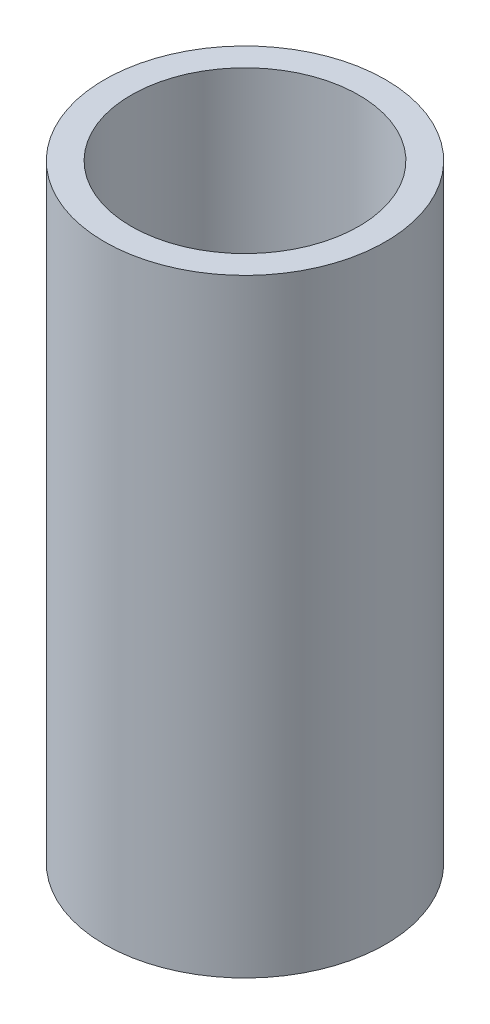
ISO-10303-21;
HEADER;
FILE_DESCRIPTION(('STEP AP214'),'2;1');
FILE_NAME('part.step','',(''),(''),'','','');
FILE_SCHEMA(('AUTOMOTIVE_DESIGN { 1 0 10303 214 1 1 1 1 }'));
ENDSEC;
DATA;
#1=APPLICATION_CONTEXT('core data for automotive mechanical design processes');
#2=APPLICATION_PROTOCOL_DEFINITION('international standard','automotive_design',2000,#1);
#3=PRODUCT_CONTEXT('',#1,'mechanical');
#4=PRODUCT('Part','Part','',(#3));
#5=PRODUCT_RELATED_PRODUCT_CATEGORY('part','',(#4));
#6=PRODUCT_DEFINITION_FORMATION('','',#4);
#7=PRODUCT_DEFINITION_CONTEXT('part definition',#1,'design');
#8=PRODUCT_DEFINITION('design','',#6,#7);
#9=PRODUCT_DEFINITION_SHAPE('','',#8);
#10=(LENGTH_UNIT() NAMED_UNIT(*) SI_UNIT(.MILLI.,.METRE.));
#11=(NAMED_UNIT(*) PLANE_ANGLE_UNIT() SI_UNIT($,.RADIAN.));
#12=(NAMED_UNIT(*) SI_UNIT($,.STERADIAN.) SOLID_ANGLE_UNIT());
#13=UNCERTAINTY_MEASURE_WITH_UNIT(LENGTH_MEASURE(1.E-05),#10,'distance_accuracy_value','');
#14=(GEOMETRIC_REPRESENTATION_CONTEXT(3) GLOBAL_UNCERTAINTY_ASSIGNED_CONTEXT((#13)) GLOBAL_UNIT_ASSIGNED_CONTEXT((#10,
#11,#12)) REPRESENTATION_CONTEXT('',''));
#15=CARTESIAN_POINT('',(0.,0.,0.));
#16=DIRECTION('',(0.,0.,1.));
#17=DIRECTION('',(1.,0.,0.));
#18=AXIS2_PLACEMENT_3D('',#15,#16,#17);
#19=CARTESIAN_POINT('',(0.,55.,0.));
#20=DIRECTION('',(0.,1.,0.));
#21=DIRECTION('',(0.,0.,1.));
#22=AXIS2_PLACEMENT_3D('',#19,#20,#21);
#23=PLANE('',#22);
#24=CARTESIAN_POINT('',(0.,55.,0.));
#25=DIRECTION('',(0.,1.,0.));
#26=DIRECTION('',(0.,0.,1.));
#27=AXIS2_PLACEMENT_3D('',#24,#25,#26);
#28=CIRCLE('',#27,12.7);
#29=CARTESIAN_POINT('',(0.,55.,12.7));
#30=VERTEX_POINT('',#29);
#31=EDGE_CURVE('E10',#30,#30,#28,.T.);
#32=ORIENTED_EDGE('',*,*,#31,.T.);
#33=EDGE_LOOP('',(#32));
#34=FACE_BOUND('',#33,.T.);
#35=CARTESIAN_POINT('',(0.,55.,0.));
#36=DIRECTION('',(0.,1.,0.));
#37=DIRECTION('',(0.,0.,1.));
#38=AXIS2_PLACEMENT_3D('',#35,#36,#37);
#39=CIRCLE('',#38,10.287);
#40=CARTESIAN_POINT('',(0.,55.,10.287));
#41=VERTEX_POINT('',#40);
#42=EDGE_CURVE('E42',#41,#41,#39,.T.);
#43=ORIENTED_EDGE('',*,*,#42,.F.);
#44=EDGE_LOOP('',(#43));
#45=FACE_BOUND('',#44,.T.);
#46=ADVANCED_FACE('F31',(#34,#45),#23,.T.);
#47=CARTESIAN_POINT('',(0.,0.,0.));
#48=DIRECTION('',(0.,1.,0.));
#49=DIRECTION('',(0.,0.,1.));
#50=AXIS2_PLACEMENT_3D('',#47,#48,#49);
#51=PLANE('',#50);
#52=CARTESIAN_POINT('',(0.,0.,0.));
#53=DIRECTION('',(0.,1.,0.));
#54=DIRECTION('',(0.,0.,1.));
#55=AXIS2_PLACEMENT_3D('',#52,#53,#54);
#56=CIRCLE('',#55,12.7);
#57=CARTESIAN_POINT('',(0.,0.,12.7));
#58=VERTEX_POINT('',#57);
#59=EDGE_CURVE('E35',#58,#58,#56,.T.);
#60=ORIENTED_EDGE('',*,*,#59,.F.);
#61=EDGE_LOOP('',(#60));
#62=FACE_BOUND('',#61,.T.);
#63=CARTESIAN_POINT('',(0.,0.,0.));
#64=DIRECTION('',(0.,1.,0.));
#65=DIRECTION('',(0.,0.,1.));
#66=AXIS2_PLACEMENT_3D('',#63,#64,#65);
#67=CIRCLE('',#66,10.287);
#68=CARTESIAN_POINT('',(0.,0.,10.287));
#69=VERTEX_POINT('',#68);
#70=EDGE_CURVE('E44',#69,#69,#67,.T.);
#71=ORIENTED_EDGE('',*,*,#70,.T.);
#72=EDGE_LOOP('',(#71));
#73=FACE_BOUND('',#72,.T.);
#74=ADVANCED_FACE('F54',(#62,#73),#51,.F.);
#75=CARTESIAN_POINT('',(0.,55.,0.));
#76=DIRECTION('',(0.,-1.,0.));
#77=DIRECTION('',(0.,0.,-1.));
#78=AXIS2_PLACEMENT_3D('',#75,#76,#77);
#79=CYLINDRICAL_SURFACE('',#78,12.7);
#80=ORIENTED_EDGE('',*,*,#31,.F.);
#81=EDGE_LOOP('',(#80));
#82=FACE_BOUND('',#81,.T.);
#83=ORIENTED_EDGE('',*,*,#59,.T.);
#84=EDGE_LOOP('',(#83));
#85=FACE_BOUND('',#84,.T.);
#86=ADVANCED_FACE('F33',(#82,#85),#79,.T.);
#87=CARTESIAN_POINT('',(0.,55.,0.));
#88=DIRECTION('',(0.,-1.,0.));
#89=DIRECTION('',(0.,0.,-1.));
#90=AXIS2_PLACEMENT_3D('',#87,#88,#89);
#91=CYLINDRICAL_SURFACE('',#90,10.287);
#92=ORIENTED_EDGE('',*,*,#42,.T.);
#93=EDGE_LOOP('',(#92));
#94=FACE_BOUND('',#93,.T.);
#95=ORIENTED_EDGE('',*,*,#70,.F.);
#96=EDGE_LOOP('',(#95));
#97=FACE_BOUND('',#96,.T.);
#98=ADVANCED_FACE('F50',(#94,#97),#91,.F.);
#99=CLOSED_SHELL('',(#46,#74,#86,#98));
#100=MANIFOLD_SOLID_BREP('B2',#99);
#101=ADVANCED_BREP_SHAPE_REPRESENTATION('',(#18,#100),#14);
#102=SHAPE_DEFINITION_REPRESENTATION(#9,#101);
ENDSEC;
END-ISO-10303-21;
